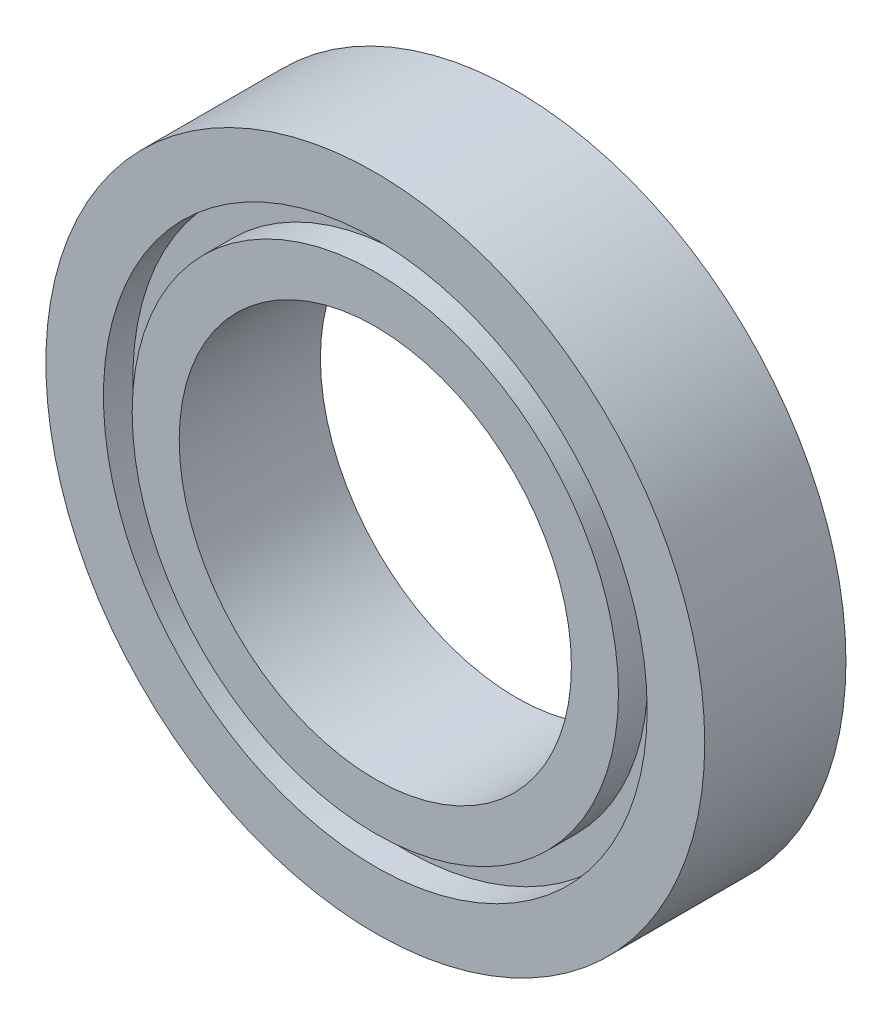
ISO-10303-21;
HEADER;
FILE_DESCRIPTION(('STEP AP214'),'2;1');
FILE_NAME('part.step','',(''),(''),'','','');
FILE_SCHEMA(('AUTOMOTIVE_DESIGN { 1 0 10303 214 1 1 1 1 }'));
ENDSEC;
DATA;
#1=APPLICATION_CONTEXT('core data for automotive mechanical design processes');
#2=APPLICATION_PROTOCOL_DEFINITION('international standard','automotive_design',2000,#1);
#3=PRODUCT_CONTEXT('',#1,'mechanical');
#4=PRODUCT('Part','Part','',(#3));
#5=PRODUCT_RELATED_PRODUCT_CATEGORY('part','',(#4));
#6=PRODUCT_DEFINITION_FORMATION('','',#4);
#7=PRODUCT_DEFINITION_CONTEXT('part definition',#1,'design');
#8=PRODUCT_DEFINITION('design','',#6,#7);
#9=PRODUCT_DEFINITION_SHAPE('','',#8);
#10=(LENGTH_UNIT() NAMED_UNIT(*) SI_UNIT(.MILLI.,.METRE.));
#11=(NAMED_UNIT(*) PLANE_ANGLE_UNIT() SI_UNIT($,.RADIAN.));
#12=(NAMED_UNIT(*) SI_UNIT($,.STERADIAN.) SOLID_ANGLE_UNIT());
#13=UNCERTAINTY_MEASURE_WITH_UNIT(LENGTH_MEASURE(1.E-05),#10,'distance_accuracy_value','');
#14=(GEOMETRIC_REPRESENTATION_CONTEXT(3) GLOBAL_UNCERTAINTY_ASSIGNED_CONTEXT((#13)) GLOBAL_UNIT_ASSIGNED_CONTEXT((#10,
#11,#12)) REPRESENTATION_CONTEXT('',''));
#15=CARTESIAN_POINT('',(0.,0.,0.));
#16=DIRECTION('',(0.,0.,1.));
#17=DIRECTION('',(1.,0.,0.));
#18=AXIS2_PLACEMENT_3D('',#15,#16,#17);
#19=CARTESIAN_POINT('',(0.,0.,4.5));
#20=DIRECTION('',(0.,0.,-1.));
#21=DIRECTION('',(1.,0.,0.));
#22=AXIS2_PLACEMENT_3D('',#19,#20,#21);
#23=PLANE('',#22);
#24=CARTESIAN_POINT('',(0.,0.,4.5));
#25=DIRECTION('',(0.,0.,1.));
#26=DIRECTION('',(1.,0.,0.));
#27=AXIS2_PLACEMENT_3D('',#24,#25,#26);
#28=CIRCLE('',#27,12.5);
#29=CARTESIAN_POINT('',(12.5,0.,4.5));
#30=VERTEX_POINT('',#29);
#31=EDGE_CURVE('E48',#30,#30,#28,.T.);
#32=ORIENTED_EDGE('',*,*,#31,.F.);
#33=EDGE_LOOP('',(#32));
#34=FACE_BOUND('',#33,.T.);
#35=CARTESIAN_POINT('',(0.,0.,4.5));
#36=DIRECTION('',(0.,0.,1.));
#37=DIRECTION('',(1.,0.,0.));
#38=AXIS2_PLACEMENT_3D('',#35,#36,#37);
#39=CIRCLE('',#38,15.4980961096746);
#40=CARTESIAN_POINT('',(15.4980961096746,0.,4.5));
#41=VERTEX_POINT('',#40);
#42=EDGE_CURVE('E74',#41,#41,#39,.T.);
#43=ORIENTED_EDGE('',*,*,#42,.T.);
#44=EDGE_LOOP('',(#43));
#45=FACE_BOUND('',#44,.T.);
#46=ADVANCED_FACE('F35',(#34,#45),#23,.F.);
#47=CARTESIAN_POINT('',(0.,0.,4.5));
#48=DIRECTION('',(0.,0.,1.));
#49=DIRECTION('',(1.,0.,0.));
#50=AXIS2_PLACEMENT_3D('',#47,#48,#49);
#51=CIRCLE('',#50,21.);
#52=CARTESIAN_POINT('',(21.,0.,4.5));
#53=VERTEX_POINT('',#52);
#54=EDGE_CURVE('E39',#53,#53,#51,.T.);
#55=ORIENTED_EDGE('',*,*,#54,.T.);
#56=EDGE_LOOP('',(#55));
#57=FACE_BOUND('',#56,.T.);
#58=CARTESIAN_POINT('',(0.,0.,4.5));
#59=DIRECTION('',(0.,0.,1.));
#60=DIRECTION('',(1.,0.,0.));
#61=AXIS2_PLACEMENT_3D('',#58,#59,#60);
#62=CIRCLE('',#61,17.3301127162425);
#63=CARTESIAN_POINT('',(17.3301127162425,0.,4.5));
#64=VERTEX_POINT('',#63);
#65=EDGE_CURVE('E71',#64,#64,#62,.T.);
#66=ORIENTED_EDGE('',*,*,#65,.F.);
#67=EDGE_LOOP('',(#66));
#68=FACE_BOUND('',#67,.T.);
#69=ADVANCED_FACE('F98',(#57,#68),#23,.F.);
#70=CARTESIAN_POINT('',(0.,0.,-4.5));
#71=DIRECTION('',(0.,0.,-1.));
#72=DIRECTION('',(1.,0.,0.));
#73=AXIS2_PLACEMENT_3D('',#70,#71,#72);
#74=PLANE('',#73);
#75=CARTESIAN_POINT('',(0.,0.,-4.5));
#76=DIRECTION('',(0.,0.,1.));
#77=DIRECTION('',(1.,0.,0.));
#78=AXIS2_PLACEMENT_3D('',#75,#76,#77);
#79=CIRCLE('',#78,21.);
#80=CARTESIAN_POINT('',(21.,0.,-4.5));
#81=VERTEX_POINT('',#80);
#82=EDGE_CURVE('E10',#81,#81,#79,.T.);
#83=ORIENTED_EDGE('',*,*,#82,.F.);
#84=EDGE_LOOP('',(#83));
#85=FACE_BOUND('',#84,.T.);
#86=CARTESIAN_POINT('',(0.,0.,-4.5));
#87=DIRECTION('',(0.,0.,1.));
#88=DIRECTION('',(1.,0.,0.));
#89=AXIS2_PLACEMENT_3D('',#86,#87,#88);
#90=CIRCLE('',#89,17.3301127162425);
#91=CARTESIAN_POINT('',(17.3301127162425,0.,-4.5));
#92=VERTEX_POINT('',#91);
#93=EDGE_CURVE('E51',#92,#92,#90,.T.);
#94=ORIENTED_EDGE('',*,*,#93,.T.);
#95=EDGE_LOOP('',(#94));
#96=FACE_BOUND('',#95,.T.);
#97=ADVANCED_FACE('F100',(#85,#96),#74,.T.);
#98=CARTESIAN_POINT('',(0.,0.,-4.5));
#99=DIRECTION('',(0.,0.,1.));
#100=DIRECTION('',(1.,0.,0.));
#101=AXIS2_PLACEMENT_3D('',#98,#99,#100);
#102=CIRCLE('',#101,12.5);
#103=CARTESIAN_POINT('',(12.5,0.,-4.5));
#104=VERTEX_POINT('',#103);
#105=EDGE_CURVE('E46',#104,#104,#102,.T.);
#106=ORIENTED_EDGE('',*,*,#105,.T.);
#107=EDGE_LOOP('',(#106));
#108=FACE_BOUND('',#107,.T.);
#109=CARTESIAN_POINT('',(0.,0.,-4.5));
#110=DIRECTION('',(0.,0.,1.));
#111=DIRECTION('',(1.,0.,0.));
#112=AXIS2_PLACEMENT_3D('',#109,#110,#111);
#113=CIRCLE('',#112,15.4980961096746);
#114=CARTESIAN_POINT('',(15.4980961096746,0.,-4.5));
#115=VERTEX_POINT('',#114);
#116=EDGE_CURVE('E62',#115,#115,#113,.T.);
#117=ORIENTED_EDGE('',*,*,#116,.F.);
#118=EDGE_LOOP('',(#117));
#119=FACE_BOUND('',#118,.T.);
#120=ADVANCED_FACE('F106',(#108,#119),#74,.T.);
#121=CARTESIAN_POINT('',(0.,0.,-4.5));
#122=DIRECTION('',(0.,0.,1.));
#123=DIRECTION('',(-1.,0.,0.));
#124=AXIS2_PLACEMENT_3D('',#121,#122,#123);
#125=CYLINDRICAL_SURFACE('',#124,21.);
#126=ORIENTED_EDGE('',*,*,#82,.T.);
#127=EDGE_LOOP('',(#126));
#128=FACE_BOUND('',#127,.T.);
#129=ORIENTED_EDGE('',*,*,#54,.F.);
#130=EDGE_LOOP('',(#129));
#131=FACE_BOUND('',#130,.T.);
#132=ADVANCED_FACE('F37',(#128,#131),#125,.T.);
#133=CARTESIAN_POINT('',(0.,0.,-4.5));
#134=DIRECTION('',(0.,0.,1.));
#135=DIRECTION('',(-1.,0.,0.));
#136=AXIS2_PLACEMENT_3D('',#133,#134,#135);
#137=CYLINDRICAL_SURFACE('',#136,12.5);
#138=ORIENTED_EDGE('',*,*,#105,.F.);
#139=EDGE_LOOP('',(#138));
#140=FACE_BOUND('',#139,.T.);
#141=ORIENTED_EDGE('',*,*,#31,.T.);
#142=EDGE_LOOP('',(#141));
#143=FACE_BOUND('',#142,.T.);
#144=ADVANCED_FACE('F111',(#140,#143),#137,.F.);
#145=CARTESIAN_POINT('',(0.,0.,0.));
#146=DIRECTION('',(0.,0.,-1.));
#147=DIRECTION('',(1.,0.,0.));
#148=AXIS2_PLACEMENT_3D('',#145,#146,#147);
#149=CYLINDRICAL_SURFACE('',#148,17.3301127162425);
#150=ORIENTED_EDGE('',*,*,#93,.F.);
#151=EDGE_LOOP('',(#150));
#152=FACE_BOUND('',#151,.T.);
#153=CARTESIAN_POINT('',(0.,0.,-2.62435073559293));
#154=DIRECTION('',(0.,0.,1.));
#155=DIRECTION('',(1.,0.,0.));
#156=AXIS2_PLACEMENT_3D('',#153,#154,#155);
#157=CIRCLE('',#156,17.3301127162425);
#158=CARTESIAN_POINT('',(17.3301127162425,0.,-2.62435073559293));
#159=VERTEX_POINT('',#158);
#160=EDGE_CURVE('E56',#159,#159,#157,.T.);
#161=ORIENTED_EDGE('',*,*,#160,.T.);
#162=EDGE_LOOP('',(#161));
#163=FACE_BOUND('',#162,.T.);
#164=ADVANCED_FACE('F114',(#152,#163),#149,.F.);
#165=CARTESIAN_POINT('',(0.,15.4980961096746,-2.62435073559293));
#166=DIRECTION('',(0.,0.,-1.));
#167=DIRECTION('',(1.,0.,0.));
#168=AXIS2_PLACEMENT_3D('',#165,#166,#167);
#169=PLANE('',#168);
#170=ORIENTED_EDGE('',*,*,#160,.F.);
#171=EDGE_LOOP('',(#170));
#172=FACE_BOUND('',#171,.T.);
#173=CARTESIAN_POINT('',(0.,0.,-2.62435073559293));
#174=DIRECTION('',(0.,0.,1.));
#175=DIRECTION('',(1.,0.,0.));
#176=AXIS2_PLACEMENT_3D('',#173,#174,#175);
#177=CIRCLE('',#176,15.4980961096746);
#178=CARTESIAN_POINT('',(15.4980961096746,0.,-2.62435073559293));
#179=VERTEX_POINT('',#178);
#180=EDGE_CURVE('E59',#179,#179,#177,.T.);
#181=ORIENTED_EDGE('',*,*,#180,.T.);
#182=EDGE_LOOP('',(#181));
#183=FACE_BOUND('',#182,.T.);
#184=ADVANCED_FACE('F118',(#172,#183),#169,.T.);
#185=CARTESIAN_POINT('',(0.,0.,0.));
#186=DIRECTION('',(0.,0.,-1.));
#187=DIRECTION('',(1.,0.,0.));
#188=AXIS2_PLACEMENT_3D('',#185,#186,#187);
#189=CYLINDRICAL_SURFACE('',#188,15.4980961096746);
#190=ORIENTED_EDGE('',*,*,#180,.F.);
#191=EDGE_LOOP('',(#190));
#192=FACE_BOUND('',#191,.T.);
#193=ORIENTED_EDGE('',*,*,#116,.T.);
#194=EDGE_LOOP('',(#193));
#195=FACE_BOUND('',#194,.T.);
#196=ADVANCED_FACE('F83',(#192,#195),#189,.T.);
#197=CARTESIAN_POINT('',(0.,0.,0.));
#198=DIRECTION('',(0.,0.,-1.));
#199=DIRECTION('',(1.,0.,0.));
#200=AXIS2_PLACEMENT_3D('',#197,#198,#199);
#201=CYLINDRICAL_SURFACE('',#200,15.4980961096746);
#202=ORIENTED_EDGE('',*,*,#42,.F.);
#203=EDGE_LOOP('',(#202));
#204=FACE_BOUND('',#203,.T.);
#205=CARTESIAN_POINT('',(0.,0.,2.62435073559293));
#206=DIRECTION('',(0.,0.,1.));
#207=DIRECTION('',(1.,0.,0.));
#208=AXIS2_PLACEMENT_3D('',#205,#206,#207);
#209=CIRCLE('',#208,15.4980961096746);
#210=CARTESIAN_POINT('',(15.4980961096746,0.,2.62435073559293));
#211=VERTEX_POINT('',#210);
#212=EDGE_CURVE('E65',#211,#211,#209,.T.);
#213=ORIENTED_EDGE('',*,*,#212,.T.);
#214=EDGE_LOOP('',(#213));
#215=FACE_BOUND('',#214,.T.);
#216=ADVANCED_FACE('F79',(#204,#215),#201,.T.);
#217=CARTESIAN_POINT('',(0.,15.4980961096746,2.62435073559293));
#218=DIRECTION('',(0.,0.,1.));
#219=DIRECTION('',(-1.,0.,0.));
#220=AXIS2_PLACEMENT_3D('',#217,#218,#219);
#221=PLANE('',#220);
#222=ORIENTED_EDGE('',*,*,#212,.F.);
#223=EDGE_LOOP('',(#222));
#224=FACE_BOUND('',#223,.T.);
#225=CARTESIAN_POINT('',(0.,0.,2.62435073559293));
#226=DIRECTION('',(0.,0.,1.));
#227=DIRECTION('',(1.,0.,0.));
#228=AXIS2_PLACEMENT_3D('',#225,#226,#227);
#229=CIRCLE('',#228,17.3301127162425);
#230=CARTESIAN_POINT('',(17.3301127162425,0.,2.62435073559293));
#231=VERTEX_POINT('',#230);
#232=EDGE_CURVE('E68',#231,#231,#229,.T.);
#233=ORIENTED_EDGE('',*,*,#232,.T.);
#234=EDGE_LOOP('',(#233));
#235=FACE_BOUND('',#234,.T.);
#236=ADVANCED_FACE('F82',(#224,#235),#221,.T.);
#237=CARTESIAN_POINT('',(0.,0.,0.));
#238=DIRECTION('',(0.,0.,-1.));
#239=DIRECTION('',(1.,0.,0.));
#240=AXIS2_PLACEMENT_3D('',#237,#238,#239);
#241=CYLINDRICAL_SURFACE('',#240,17.3301127162425);
#242=ORIENTED_EDGE('',*,*,#232,.F.);
#243=EDGE_LOOP('',(#242));
#244=FACE_BOUND('',#243,.T.);
#245=ORIENTED_EDGE('',*,*,#65,.T.);
#246=EDGE_LOOP('',(#245));
#247=FACE_BOUND('',#246,.T.);
#248=ADVANCED_FACE('F89',(#244,#247),#241,.F.);
#249=CLOSED_SHELL('',(#46,#69,#97,#120,#132,#144,#164,#184,#196,#216,#236,#248));
#250=MANIFOLD_SOLID_BREP('B2',#249);
#251=ADVANCED_BREP_SHAPE_REPRESENTATION('',(#18,#250),#14);
#252=SHAPE_DEFINITION_REPRESENTATION(#9,#251);
ENDSEC;
END-ISO-10303-21;
